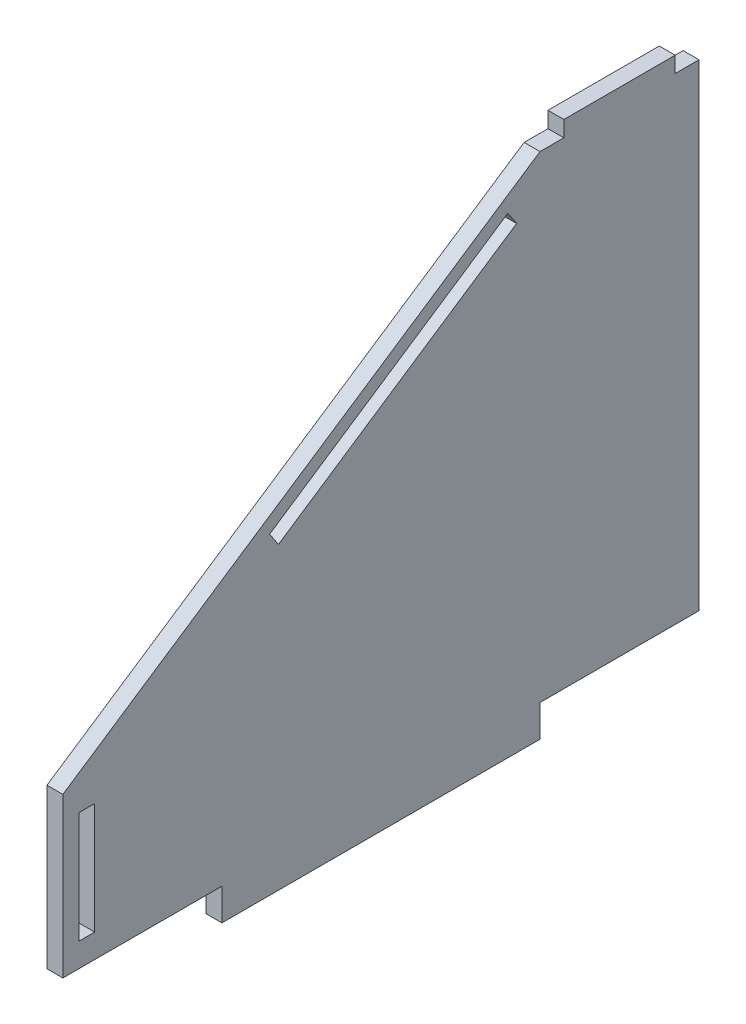
ISO-10303-21;
HEADER;
FILE_DESCRIPTION(('STEP AP214'),'2;1');
FILE_NAME('part.step','',(''),(''),'','','');
FILE_SCHEMA(('AUTOMOTIVE_DESIGN { 1 0 10303 214 1 1 1 1 }'));
ENDSEC;
DATA;
#1=APPLICATION_CONTEXT('core data for automotive mechanical design processes');
#2=APPLICATION_PROTOCOL_DEFINITION('international standard','automotive_design',2000,#1);
#3=PRODUCT_CONTEXT('',#1,'mechanical');
#4=PRODUCT('Part','Part','',(#3));
#5=PRODUCT_RELATED_PRODUCT_CATEGORY('part','',(#4));
#6=PRODUCT_DEFINITION_FORMATION('','',#4);
#7=PRODUCT_DEFINITION_CONTEXT('part definition',#1,'design');
#8=PRODUCT_DEFINITION('design','',#6,#7);
#9=PRODUCT_DEFINITION_SHAPE('','',#8);
#10=(LENGTH_UNIT() NAMED_UNIT(*) SI_UNIT(.MILLI.,.METRE.));
#11=(NAMED_UNIT(*) PLANE_ANGLE_UNIT() SI_UNIT($,.RADIAN.));
#12=(NAMED_UNIT(*) SI_UNIT($,.STERADIAN.) SOLID_ANGLE_UNIT());
#13=UNCERTAINTY_MEASURE_WITH_UNIT(LENGTH_MEASURE(1.E-05),#10,'distance_accuracy_value','');
#14=(GEOMETRIC_REPRESENTATION_CONTEXT(3) GLOBAL_UNCERTAINTY_ASSIGNED_CONTEXT((#13)) GLOBAL_UNIT_ASSIGNED_CONTEXT((#10,
#11,#12)) REPRESENTATION_CONTEXT('',''));
#15=CARTESIAN_POINT('',(0.,0.,0.));
#16=DIRECTION('',(0.,0.,1.));
#17=DIRECTION('',(1.,0.,0.));
#18=AXIS2_PLACEMENT_3D('',#15,#16,#17);
#19=CARTESIAN_POINT('',(5.,0.,0.));
#20=DIRECTION('',(1.,0.,0.));
#21=DIRECTION('',(0.,0.,-1.));
#22=AXIS2_PLACEMENT_3D('',#19,#20,#21);
#23=PLANE('',#22);
#24=DIRECTION('',(0.,0.,-1.));
#25=VECTOR('',#24,1.);
#26=CARTESIAN_POINT('',(5.,7.5,-5.00000000000001));
#27=LINE('',#26,#25);
#28=CARTESIAN_POINT('',(5.,7.5,-5.00000000000001));
#29=VERTEX_POINT('',#28);
#30=CARTESIAN_POINT('',(5.,7.5,-10.));
#31=VERTEX_POINT('',#30);
#32=EDGE_CURVE('E213',#29,#31,#27,.T.);
#33=ORIENTED_EDGE('',*,*,#32,.F.);
#34=DIRECTION('',(0.,-1.,0.));
#35=VECTOR('',#34,1.);
#36=CARTESIAN_POINT('',(5.,42.5,-5.));
#37=LINE('',#36,#35);
#38=CARTESIAN_POINT('',(5.,42.5,-5.));
#39=VERTEX_POINT('',#38);
#40=EDGE_CURVE('E211',#39,#29,#37,.T.);
#41=ORIENTED_EDGE('',*,*,#40,.F.);
#42=DIRECTION('',(0.,0.,1.));
#43=VECTOR('',#42,1.);
#44=CARTESIAN_POINT('',(5.,42.5,-5.));
#45=LINE('',#44,#43);
#46=CARTESIAN_POINT('',(5.,42.5,-10.));
#47=VERTEX_POINT('',#46);
#48=EDGE_CURVE('E219',#47,#39,#45,.T.);
#49=ORIENTED_EDGE('',*,*,#48,.F.);
#50=DIRECTION('',(0.,1.,0.));
#51=VECTOR('',#50,1.);
#52=CARTESIAN_POINT('',(5.,42.5,-10.));
#53=LINE('',#52,#51);
#54=EDGE_CURVE('E216',#31,#47,#53,.T.);
#55=ORIENTED_EDGE('',*,*,#54,.F.);
#56=EDGE_LOOP('',(#33,#41,#49,#55));
#57=FACE_BOUND('',#56,.T.);
#58=DIRECTION('',(0.,0.,1.));
#59=VECTOR('',#58,1.);
#60=CARTESIAN_POINT('',(5.,150.,-192.5));
#61=LINE('',#60,#59);
#62=CARTESIAN_POINT('',(5.,150.,-200.));
#63=VERTEX_POINT('',#62);
#64=CARTESIAN_POINT('',(5.,150.,-192.5));
#65=VERTEX_POINT('',#64);
#66=EDGE_CURVE('E242',#63,#65,#61,.T.);
#67=ORIENTED_EDGE('',*,*,#66,.T.);
#68=DIRECTION('',(0.,1.,0.));
#69=VECTOR('',#68,1.);
#70=CARTESIAN_POINT('',(5.,150.,-192.5));
#71=LINE('',#70,#69);
#72=CARTESIAN_POINT('',(5.,155.,-192.5));
#73=VERTEX_POINT('',#72);
#74=EDGE_CURVE('E245',#65,#73,#71,.T.);
#75=ORIENTED_EDGE('',*,*,#74,.T.);
#76=DIRECTION('',(0.,0.,1.));
#77=VECTOR('',#76,1.);
#78=CARTESIAN_POINT('',(5.,155.,-157.5));
#79=LINE('',#78,#77);
#80=CARTESIAN_POINT('',(5.,155.,-157.5));
#81=VERTEX_POINT('',#80);
#82=EDGE_CURVE('E248',#73,#81,#79,.T.);
#83=ORIENTED_EDGE('',*,*,#82,.T.);
#84=DIRECTION('',(0.,-1.,0.));
#85=VECTOR('',#84,1.);
#86=CARTESIAN_POINT('',(5.,150.,-157.5));
#87=LINE('',#86,#85);
#88=CARTESIAN_POINT('',(5.,150.,-157.5));
#89=VERTEX_POINT('',#88);
#90=EDGE_CURVE('E250',#81,#89,#87,.T.);
#91=ORIENTED_EDGE('',*,*,#90,.T.);
#92=DIRECTION('',(0.,0.,1.));
#93=VECTOR('',#92,1.);
#94=CARTESIAN_POINT('',(5.,150.,-150.));
#95=LINE('',#94,#93);
#96=CARTESIAN_POINT('',(5.,150.,-150.));
#97=VERTEX_POINT('',#96);
#98=EDGE_CURVE('E252',#89,#97,#95,.T.);
#99=ORIENTED_EDGE('',*,*,#98,.T.);
#100=DIRECTION('',(0.,-0.554700196225229,0.832050294337844));
#101=VECTOR('',#100,1.);
#102=CARTESIAN_POINT('',(5.,150.,-150.));
#103=LINE('',#102,#101);
#104=CARTESIAN_POINT('',(5.,50.,0.));
#105=VERTEX_POINT('',#104);
#106=EDGE_CURVE('E254',#97,#105,#103,.T.);
#107=ORIENTED_EDGE('',*,*,#106,.T.);
#108=DIRECTION('',(0.,-1.,0.));
#109=VECTOR('',#108,1.);
#110=CARTESIAN_POINT('',(5.,0.,0.));
#111=LINE('',#110,#109);
#112=CARTESIAN_POINT('',(5.,0.,0.));
#113=VERTEX_POINT('',#112);
#114=EDGE_CURVE('E256',#105,#113,#111,.T.);
#115=ORIENTED_EDGE('',*,*,#114,.T.);
#116=DIRECTION('',(0.,0.,-1.));
#117=VECTOR('',#116,1.);
#118=CARTESIAN_POINT('',(5.,0.,0.));
#119=LINE('',#118,#117);
#120=CARTESIAN_POINT('',(5.,0.,-50.));
#121=VERTEX_POINT('',#120);
#122=EDGE_CURVE('E258',#113,#121,#119,.T.);
#123=ORIENTED_EDGE('',*,*,#122,.T.);
#124=DIRECTION('',(0.,-1.,0.));
#125=VECTOR('',#124,1.);
#126=CARTESIAN_POINT('',(5.,0.,-50.));
#127=LINE('',#126,#125);
#128=CARTESIAN_POINT('',(5.,-10.,-50.));
#129=VERTEX_POINT('',#128);
#130=EDGE_CURVE('E260',#121,#129,#127,.T.);
#131=ORIENTED_EDGE('',*,*,#130,.T.);
#132=DIRECTION('',(0.,0.,-1.));
#133=VECTOR('',#132,1.);
#134=CARTESIAN_POINT('',(5.,-10.,-50.));
#135=LINE('',#134,#133);
#136=CARTESIAN_POINT('',(5.,-10.,-150.));
#137=VERTEX_POINT('',#136);
#138=EDGE_CURVE('E262',#129,#137,#135,.T.);
#139=ORIENTED_EDGE('',*,*,#138,.T.);
#140=DIRECTION('',(0.,1.,0.));
#141=VECTOR('',#140,1.);
#142=CARTESIAN_POINT('',(5.,0.,-150.));
#143=LINE('',#142,#141);
#144=CARTESIAN_POINT('',(5.,0.,-150.));
#145=VERTEX_POINT('',#144);
#146=EDGE_CURVE('E264',#137,#145,#143,.T.);
#147=ORIENTED_EDGE('',*,*,#146,.T.);
#148=DIRECTION('',(0.,0.,-1.));
#149=VECTOR('',#148,1.);
#150=CARTESIAN_POINT('',(5.,0.,-150.));
#151=LINE('',#150,#149);
#152=CARTESIAN_POINT('',(5.,0.,-200.));
#153=VERTEX_POINT('',#152);
#154=EDGE_CURVE('E266',#145,#153,#151,.T.);
#155=ORIENTED_EDGE('',*,*,#154,.T.);
#156=DIRECTION('',(0.,1.,0.));
#157=VECTOR('',#156,1.);
#158=CARTESIAN_POINT('',(5.,0.,-200.));
#159=LINE('',#158,#157);
#160=EDGE_CURVE('E268',#153,#63,#159,.T.);
#161=ORIENTED_EDGE('',*,*,#160,.T.);
#162=EDGE_LOOP('',(#67,#75,#83,#91,#99,#107,#115,#123,#131,#139,#147,#155,#161));
#163=FACE_BOUND('',#162,.T.);
#164=DIRECTION('',(0.,0.554700196225229,-0.832050294337843));
#165=VECTOR('',#164,1.);
#166=CARTESIAN_POINT('',(5.,134.096099521915,-142.658027471532));
#167=LINE('',#166,#165);
#168=CARTESIAN_POINT('',(5.,84.1730818616441,-67.7735009811262));
#169=VERTEX_POINT('',#168);
#170=CARTESIAN_POINT('',(5.,134.096099521915,-142.658027471532));
#171=VERTEX_POINT('',#170);
#172=EDGE_CURVE('E183',#169,#171,#167,.T.);
#173=ORIENTED_EDGE('',*,*,#172,.F.);
#174=DIRECTION('',(0.,-0.832050294337844,-0.554700196225229));
#175=VECTOR('',#174,1.);
#176=CARTESIAN_POINT('',(5.,84.1730818616441,-67.7735009811262));
#177=LINE('',#176,#175);
#178=CARTESIAN_POINT('',(5.,88.3333333333334,-65.));
#179=VERTEX_POINT('',#178);
#180=EDGE_CURVE('E175',#179,#169,#177,.T.);
#181=ORIENTED_EDGE('',*,*,#180,.F.);
#182=DIRECTION('',(0.,-0.554700196225229,0.832050294337844));
#183=VECTOR('',#182,1.);
#184=CARTESIAN_POINT('',(5.,88.3333333333334,-65.));
#185=LINE('',#184,#183);
#186=CARTESIAN_POINT('',(5.,138.256350993604,-139.884526490406));
#187=VERTEX_POINT('',#186);
#188=EDGE_CURVE('E197',#187,#179,#185,.T.);
#189=ORIENTED_EDGE('',*,*,#188,.F.);
#190=DIRECTION('',(0.,0.832050294337843,0.55470019622523));
#191=VECTOR('',#190,1.);
#192=CARTESIAN_POINT('',(5.,138.256350993604,-139.884526490406));
#193=LINE('',#192,#191);
#194=EDGE_CURVE('E195',#171,#187,#193,.T.);
#195=ORIENTED_EDGE('',*,*,#194,.F.);
#196=EDGE_LOOP('',(#173,#181,#189,#195));
#197=FACE_BOUND('',#196,.T.);
#198=ADVANCED_FACE('F32',(#57,#163,#197),#23,.T.);
#199=CARTESIAN_POINT('',(0.,0.,0.));
#200=DIRECTION('',(1.,0.,0.));
#201=DIRECTION('',(0.,0.,-1.));
#202=AXIS2_PLACEMENT_3D('',#199,#200,#201);
#203=PLANE('',#202);
#204=DIRECTION('',(0.,-1.,0.));
#205=VECTOR('',#204,1.);
#206=CARTESIAN_POINT('',(0.,42.5,-5.));
#207=LINE('',#206,#205);
#208=CARTESIAN_POINT('',(0.,42.5,-5.));
#209=VERTEX_POINT('',#208);
#210=CARTESIAN_POINT('',(0.,7.5,-5.00000000000001));
#211=VERTEX_POINT('',#210);
#212=EDGE_CURVE('E191',#209,#211,#207,.T.);
#213=ORIENTED_EDGE('',*,*,#212,.T.);
#214=DIRECTION('',(0.,0.,-1.));
#215=VECTOR('',#214,1.);
#216=CARTESIAN_POINT('',(0.,7.5,-5.00000000000001));
#217=LINE('',#216,#215);
#218=CARTESIAN_POINT('',(0.,7.5,-10.));
#219=VERTEX_POINT('',#218);
#220=EDGE_CURVE('E224',#211,#219,#217,.T.);
#221=ORIENTED_EDGE('',*,*,#220,.T.);
#222=DIRECTION('',(0.,1.,0.));
#223=VECTOR('',#222,1.);
#224=CARTESIAN_POINT('',(0.,42.5,-10.));
#225=LINE('',#224,#223);
#226=CARTESIAN_POINT('',(0.,42.5,-10.));
#227=VERTEX_POINT('',#226);
#228=EDGE_CURVE('E227',#219,#227,#225,.T.);
#229=ORIENTED_EDGE('',*,*,#228,.T.);
#230=DIRECTION('',(0.,0.,1.));
#231=VECTOR('',#230,1.);
#232=CARTESIAN_POINT('',(0.,42.5,-5.));
#233=LINE('',#232,#231);
#234=EDGE_CURVE('E214',#227,#209,#233,.T.);
#235=ORIENTED_EDGE('',*,*,#234,.T.);
#236=EDGE_LOOP('',(#213,#221,#229,#235));
#237=FACE_BOUND('',#236,.T.);
#238=DIRECTION('',(0.,0.,1.));
#239=VECTOR('',#238,1.);
#240=CARTESIAN_POINT('',(0.,150.,-192.5));
#241=LINE('',#240,#239);
#242=CARTESIAN_POINT('',(0.,150.,-200.));
#243=VERTEX_POINT('',#242);
#244=CARTESIAN_POINT('',(0.,150.,-192.5));
#245=VERTEX_POINT('',#244);
#246=EDGE_CURVE('E241',#243,#245,#241,.T.);
#247=ORIENTED_EDGE('',*,*,#246,.F.);
#248=DIRECTION('',(0.,1.,0.));
#249=VECTOR('',#248,1.);
#250=CARTESIAN_POINT('',(0.,0.,-200.));
#251=LINE('',#250,#249);
#252=CARTESIAN_POINT('',(0.,0.,-200.));
#253=VERTEX_POINT('',#252);
#254=EDGE_CURVE('E246',#253,#243,#251,.T.);
#255=ORIENTED_EDGE('',*,*,#254,.F.);
#256=DIRECTION('',(0.,0.,-1.));
#257=VECTOR('',#256,1.);
#258=CARTESIAN_POINT('',(0.,0.,-150.));
#259=LINE('',#258,#257);
#260=CARTESIAN_POINT('',(0.,0.,-150.));
#261=VERTEX_POINT('',#260);
#262=EDGE_CURVE('E293',#261,#253,#259,.T.);
#263=ORIENTED_EDGE('',*,*,#262,.F.);
#264=DIRECTION('',(0.,1.,0.));
#265=VECTOR('',#264,1.);
#266=CARTESIAN_POINT('',(0.,0.,-150.));
#267=LINE('',#266,#265);
#268=CARTESIAN_POINT('',(0.,-10.,-150.));
#269=VERTEX_POINT('',#268);
#270=EDGE_CURVE('E291',#269,#261,#267,.T.);
#271=ORIENTED_EDGE('',*,*,#270,.F.);
#272=DIRECTION('',(0.,0.,-1.));
#273=VECTOR('',#272,1.);
#274=CARTESIAN_POINT('',(0.,-10.,-50.));
#275=LINE('',#274,#273);
#276=CARTESIAN_POINT('',(0.,-10.,-50.));
#277=VERTEX_POINT('',#276);
#278=EDGE_CURVE('E289',#277,#269,#275,.T.);
#279=ORIENTED_EDGE('',*,*,#278,.F.);
#280=DIRECTION('',(0.,-1.,0.));
#281=VECTOR('',#280,1.);
#282=CARTESIAN_POINT('',(0.,0.,-50.));
#283=LINE('',#282,#281);
#284=CARTESIAN_POINT('',(0.,0.,-50.));
#285=VERTEX_POINT('',#284);
#286=EDGE_CURVE('E287',#285,#277,#283,.T.);
#287=ORIENTED_EDGE('',*,*,#286,.F.);
#288=DIRECTION('',(0.,0.,-1.));
#289=VECTOR('',#288,1.);
#290=CARTESIAN_POINT('',(0.,0.,0.));
#291=LINE('',#290,#289);
#292=CARTESIAN_POINT('',(0.,0.,0.));
#293=VERTEX_POINT('',#292);
#294=EDGE_CURVE('E285',#293,#285,#291,.T.);
#295=ORIENTED_EDGE('',*,*,#294,.F.);
#296=DIRECTION('',(0.,-1.,0.));
#297=VECTOR('',#296,1.);
#298=CARTESIAN_POINT('',(0.,0.,0.));
#299=LINE('',#298,#297);
#300=CARTESIAN_POINT('',(0.,50.,0.));
#301=VERTEX_POINT('',#300);
#302=EDGE_CURVE('E283',#301,#293,#299,.T.);
#303=ORIENTED_EDGE('',*,*,#302,.F.);
#304=DIRECTION('',(0.,-0.554700196225229,0.832050294337844));
#305=VECTOR('',#304,1.);
#306=CARTESIAN_POINT('',(0.,150.,-150.));
#307=LINE('',#306,#305);
#308=CARTESIAN_POINT('',(0.,150.,-150.));
#309=VERTEX_POINT('',#308);
#310=EDGE_CURVE('E281',#309,#301,#307,.T.);
#311=ORIENTED_EDGE('',*,*,#310,.F.);
#312=DIRECTION('',(0.,0.,1.));
#313=VECTOR('',#312,1.);
#314=CARTESIAN_POINT('',(0.,150.,-150.));
#315=LINE('',#314,#313);
#316=CARTESIAN_POINT('',(0.,150.,-157.5));
#317=VERTEX_POINT('',#316);
#318=EDGE_CURVE('E279',#317,#309,#315,.T.);
#319=ORIENTED_EDGE('',*,*,#318,.F.);
#320=DIRECTION('',(0.,-1.,0.));
#321=VECTOR('',#320,1.);
#322=CARTESIAN_POINT('',(0.,150.,-157.5));
#323=LINE('',#322,#321);
#324=CARTESIAN_POINT('',(0.,155.,-157.5));
#325=VERTEX_POINT('',#324);
#326=EDGE_CURVE('E277',#325,#317,#323,.T.);
#327=ORIENTED_EDGE('',*,*,#326,.F.);
#328=DIRECTION('',(0.,0.,1.));
#329=VECTOR('',#328,1.);
#330=CARTESIAN_POINT('',(0.,155.,-157.5));
#331=LINE('',#330,#329);
#332=CARTESIAN_POINT('',(0.,155.,-192.5));
#333=VERTEX_POINT('',#332);
#334=EDGE_CURVE('E275',#333,#325,#331,.T.);
#335=ORIENTED_EDGE('',*,*,#334,.F.);
#336=DIRECTION('',(0.,1.,0.));
#337=VECTOR('',#336,1.);
#338=CARTESIAN_POINT('',(0.,150.,-192.5));
#339=LINE('',#338,#337);
#340=EDGE_CURVE('E273',#245,#333,#339,.T.);
#341=ORIENTED_EDGE('',*,*,#340,.F.);
#342=EDGE_LOOP('',(#247,#255,#263,#271,#279,#287,#295,#303,#311,#319,#327,#335,#341));
#343=FACE_BOUND('',#342,.T.);
#344=DIRECTION('',(0.,-0.832050294337844,-0.554700196225229));
#345=VECTOR('',#344,1.);
#346=CARTESIAN_POINT('',(0.,84.1730818616441,-67.7735009811262));
#347=LINE('',#346,#345);
#348=CARTESIAN_POINT('',(0.,88.3333333333334,-65.));
#349=VERTEX_POINT('',#348);
#350=CARTESIAN_POINT('',(0.,84.1730818616441,-67.7735009811262));
#351=VERTEX_POINT('',#350);
#352=EDGE_CURVE('E55',#349,#351,#347,.T.);
#353=ORIENTED_EDGE('',*,*,#352,.T.);
#354=DIRECTION('',(0.,0.554700196225229,-0.832050294337843));
#355=VECTOR('',#354,1.);
#356=CARTESIAN_POINT('',(0.,134.096099521915,-142.658027471532));
#357=LINE('',#356,#355);
#358=CARTESIAN_POINT('',(0.,134.096099521915,-142.658027471532));
#359=VERTEX_POINT('',#358);
#360=EDGE_CURVE('E190',#351,#359,#357,.T.);
#361=ORIENTED_EDGE('',*,*,#360,.T.);
#362=DIRECTION('',(0.,0.832050294337843,0.55470019622523));
#363=VECTOR('',#362,1.);
#364=CARTESIAN_POINT('',(0.,138.256350993604,-139.884526490406));
#365=LINE('',#364,#363);
#366=CARTESIAN_POINT('',(0.,138.256350993604,-139.884526490406));
#367=VERTEX_POINT('',#366);
#368=EDGE_CURVE('E203',#359,#367,#365,.T.);
#369=ORIENTED_EDGE('',*,*,#368,.T.);
#370=DIRECTION('',(0.,-0.554700196225229,0.832050294337844));
#371=VECTOR('',#370,1.);
#372=CARTESIAN_POINT('',(0.,88.3333333333334,-65.));
#373=LINE('',#372,#371);
#374=EDGE_CURVE('E184',#367,#349,#373,.T.);
#375=ORIENTED_EDGE('',*,*,#374,.T.);
#376=EDGE_LOOP('',(#353,#361,#369,#375));
#377=FACE_BOUND('',#376,.T.);
#378=ADVANCED_FACE('F338',(#237,#343,#377),#203,.F.);
#379=CARTESIAN_POINT('',(5.,150.,-192.5));
#380=DIRECTION('',(0.,-1.,0.));
#381=DIRECTION('',(0.,0.,-1.));
#382=AXIS2_PLACEMENT_3D('',#379,#380,#381);
#383=PLANE('',#382);
#384=ORIENTED_EDGE('',*,*,#246,.T.);
#385=DIRECTION('',(-1.,0.,0.));
#386=VECTOR('',#385,1.);
#387=CARTESIAN_POINT('',(5.,150.,-192.5));
#388=LINE('',#387,#386);
#389=EDGE_CURVE('E11',#65,#245,#388,.T.);
#390=ORIENTED_EDGE('',*,*,#389,.F.);
#391=ORIENTED_EDGE('',*,*,#66,.F.);
#392=DIRECTION('',(-1.,0.,0.));
#393=VECTOR('',#392,1.);
#394=CARTESIAN_POINT('',(5.,150.,-200.));
#395=LINE('',#394,#393);
#396=EDGE_CURVE('E270',#63,#243,#395,.T.);
#397=ORIENTED_EDGE('',*,*,#396,.T.);
#398=EDGE_LOOP('',(#384,#390,#391,#397));
#399=FACE_BOUND('',#398,.T.);
#400=ADVANCED_FACE('F34',(#399),#383,.F.);
#401=CARTESIAN_POINT('',(5.,150.,-192.5));
#402=DIRECTION('',(0.,0.,1.));
#403=DIRECTION('',(1.,0.,0.));
#404=AXIS2_PLACEMENT_3D('',#401,#402,#403);
#405=PLANE('',#404);
#406=ORIENTED_EDGE('',*,*,#340,.T.);
#407=DIRECTION('',(-1.,0.,0.));
#408=VECTOR('',#407,1.);
#409=CARTESIAN_POINT('',(5.,155.,-192.5));
#410=LINE('',#409,#408);
#411=EDGE_CURVE('E40',#73,#333,#410,.T.);
#412=ORIENTED_EDGE('',*,*,#411,.F.);
#413=ORIENTED_EDGE('',*,*,#74,.F.);
#414=ORIENTED_EDGE('',*,*,#389,.T.);
#415=EDGE_LOOP('',(#406,#412,#413,#414));
#416=FACE_BOUND('',#415,.T.);
#417=ADVANCED_FACE('F355',(#416),#405,.F.);
#418=CARTESIAN_POINT('',(5.,155.,-157.5));
#419=DIRECTION('',(0.,-1.,0.));
#420=DIRECTION('',(0.,0.,-1.));
#421=AXIS2_PLACEMENT_3D('',#418,#419,#420);
#422=PLANE('',#421);
#423=ORIENTED_EDGE('',*,*,#334,.T.);
#424=DIRECTION('',(-1.,0.,0.));
#425=VECTOR('',#424,1.);
#426=CARTESIAN_POINT('',(5.,155.,-157.5));
#427=LINE('',#426,#425);
#428=EDGE_CURVE('E325',#81,#325,#427,.T.);
#429=ORIENTED_EDGE('',*,*,#428,.F.);
#430=ORIENTED_EDGE('',*,*,#82,.F.);
#431=ORIENTED_EDGE('',*,*,#411,.T.);
#432=EDGE_LOOP('',(#423,#429,#430,#431));
#433=FACE_BOUND('',#432,.T.);
#434=ADVANCED_FACE('F332',(#433),#422,.F.);
#435=CARTESIAN_POINT('',(5.,150.,-157.5));
#436=DIRECTION('',(0.,0.,-1.));
#437=DIRECTION('',(-1.,0.,0.));
#438=AXIS2_PLACEMENT_3D('',#435,#436,#437);
#439=PLANE('',#438);
#440=ORIENTED_EDGE('',*,*,#326,.T.);
#441=DIRECTION('',(-1.,0.,0.));
#442=VECTOR('',#441,1.);
#443=CARTESIAN_POINT('',(5.,150.,-157.5));
#444=LINE('',#443,#442);
#445=EDGE_CURVE('E322',#89,#317,#444,.T.);
#446=ORIENTED_EDGE('',*,*,#445,.F.);
#447=ORIENTED_EDGE('',*,*,#90,.F.);
#448=ORIENTED_EDGE('',*,*,#428,.T.);
#449=EDGE_LOOP('',(#440,#446,#447,#448));
#450=FACE_BOUND('',#449,.T.);
#451=ADVANCED_FACE('F344',(#450),#439,.F.);
#452=CARTESIAN_POINT('',(5.,150.,-150.));
#453=DIRECTION('',(0.,-1.,0.));
#454=DIRECTION('',(0.,0.,-1.));
#455=AXIS2_PLACEMENT_3D('',#452,#453,#454);
#456=PLANE('',#455);
#457=ORIENTED_EDGE('',*,*,#318,.T.);
#458=DIRECTION('',(-1.,0.,0.));
#459=VECTOR('',#458,1.);
#460=CARTESIAN_POINT('',(5.,150.,-150.));
#461=LINE('',#460,#459);
#462=EDGE_CURVE('E319',#97,#309,#461,.T.);
#463=ORIENTED_EDGE('',*,*,#462,.F.);
#464=ORIENTED_EDGE('',*,*,#98,.F.);
#465=ORIENTED_EDGE('',*,*,#445,.T.);
#466=EDGE_LOOP('',(#457,#463,#464,#465));
#467=FACE_BOUND('',#466,.T.);
#468=ADVANCED_FACE('F348',(#467),#456,.F.);
#469=CARTESIAN_POINT('',(5.,150.,-150.));
#470=DIRECTION('',(0.,-0.832050294337844,-0.554700196225229));
#471=DIRECTION('',(0.,0.554700196225229,-0.832050294337844));
#472=AXIS2_PLACEMENT_3D('',#469,#470,#471);
#473=PLANE('',#472);
#474=ORIENTED_EDGE('',*,*,#310,.T.);
#475=DIRECTION('',(-1.,0.,0.));
#476=VECTOR('',#475,1.);
#477=CARTESIAN_POINT('',(5.,50.,0.));
#478=LINE('',#477,#476);
#479=EDGE_CURVE('E316',#105,#301,#478,.T.);
#480=ORIENTED_EDGE('',*,*,#479,.F.);
#481=ORIENTED_EDGE('',*,*,#106,.F.);
#482=ORIENTED_EDGE('',*,*,#462,.T.);
#483=EDGE_LOOP('',(#474,#480,#481,#482));
#484=FACE_BOUND('',#483,.T.);
#485=ADVANCED_FACE('F393',(#484),#473,.F.);
#486=CARTESIAN_POINT('',(5.,0.,0.));
#487=DIRECTION('',(0.,0.,-1.));
#488=DIRECTION('',(-1.,0.,0.));
#489=AXIS2_PLACEMENT_3D('',#486,#487,#488);
#490=PLANE('',#489);
#491=ORIENTED_EDGE('',*,*,#302,.T.);
#492=DIRECTION('',(-1.,0.,0.));
#493=VECTOR('',#492,1.);
#494=CARTESIAN_POINT('',(5.,0.,0.));
#495=LINE('',#494,#493);
#496=EDGE_CURVE('E313',#113,#293,#495,.T.);
#497=ORIENTED_EDGE('',*,*,#496,.F.);
#498=ORIENTED_EDGE('',*,*,#114,.F.);
#499=ORIENTED_EDGE('',*,*,#479,.T.);
#500=EDGE_LOOP('',(#491,#497,#498,#499));
#501=FACE_BOUND('',#500,.T.);
#502=ADVANCED_FACE('F390',(#501),#490,.F.);
#503=CARTESIAN_POINT('',(5.,0.,0.));
#504=DIRECTION('',(0.,1.,0.));
#505=DIRECTION('',(0.,0.,1.));
#506=AXIS2_PLACEMENT_3D('',#503,#504,#505);
#507=PLANE('',#506);
#508=ORIENTED_EDGE('',*,*,#294,.T.);
#509=DIRECTION('',(-1.,0.,0.));
#510=VECTOR('',#509,1.);
#511=CARTESIAN_POINT('',(5.,0.,-50.));
#512=LINE('',#511,#510);
#513=EDGE_CURVE('E310',#121,#285,#512,.T.);
#514=ORIENTED_EDGE('',*,*,#513,.F.);
#515=ORIENTED_EDGE('',*,*,#122,.F.);
#516=ORIENTED_EDGE('',*,*,#496,.T.);
#517=EDGE_LOOP('',(#508,#514,#515,#516));
#518=FACE_BOUND('',#517,.T.);
#519=ADVANCED_FACE('F386',(#518),#507,.F.);
#520=CARTESIAN_POINT('',(5.,0.,-50.));
#521=DIRECTION('',(0.,0.,-1.));
#522=DIRECTION('',(-1.,0.,0.));
#523=AXIS2_PLACEMENT_3D('',#520,#521,#522);
#524=PLANE('',#523);
#525=ORIENTED_EDGE('',*,*,#286,.T.);
#526=DIRECTION('',(-1.,0.,0.));
#527=VECTOR('',#526,1.);
#528=CARTESIAN_POINT('',(5.,-10.,-50.));
#529=LINE('',#528,#527);
#530=EDGE_CURVE('E307',#129,#277,#529,.T.);
#531=ORIENTED_EDGE('',*,*,#530,.F.);
#532=ORIENTED_EDGE('',*,*,#130,.F.);
#533=ORIENTED_EDGE('',*,*,#513,.T.);
#534=EDGE_LOOP('',(#525,#531,#532,#533));
#535=FACE_BOUND('',#534,.T.);
#536=ADVANCED_FACE('F382',(#535),#524,.F.);
#537=CARTESIAN_POINT('',(5.,-10.,-50.));
#538=DIRECTION('',(0.,1.,0.));
#539=DIRECTION('',(0.,0.,1.));
#540=AXIS2_PLACEMENT_3D('',#537,#538,#539);
#541=PLANE('',#540);
#542=ORIENTED_EDGE('',*,*,#278,.T.);
#543=DIRECTION('',(-1.,0.,0.));
#544=VECTOR('',#543,1.);
#545=CARTESIAN_POINT('',(5.,-10.,-150.));
#546=LINE('',#545,#544);
#547=EDGE_CURVE('E304',#137,#269,#546,.T.);
#548=ORIENTED_EDGE('',*,*,#547,.F.);
#549=ORIENTED_EDGE('',*,*,#138,.F.);
#550=ORIENTED_EDGE('',*,*,#530,.T.);
#551=EDGE_LOOP('',(#542,#548,#549,#550));
#552=FACE_BOUND('',#551,.T.);
#553=ADVANCED_FACE('F377',(#552),#541,.F.);
#554=CARTESIAN_POINT('',(5.,0.,-150.));
#555=DIRECTION('',(0.,0.,1.));
#556=DIRECTION('',(1.,0.,0.));
#557=AXIS2_PLACEMENT_3D('',#554,#555,#556);
#558=PLANE('',#557);
#559=ORIENTED_EDGE('',*,*,#270,.T.);
#560=DIRECTION('',(-1.,0.,0.));
#561=VECTOR('',#560,1.);
#562=CARTESIAN_POINT('',(5.,0.,-150.));
#563=LINE('',#562,#561);
#564=EDGE_CURVE('E301',#145,#261,#563,.T.);
#565=ORIENTED_EDGE('',*,*,#564,.F.);
#566=ORIENTED_EDGE('',*,*,#146,.F.);
#567=ORIENTED_EDGE('',*,*,#547,.T.);
#568=EDGE_LOOP('',(#559,#565,#566,#567));
#569=FACE_BOUND('',#568,.T.);
#570=ADVANCED_FACE('F371',(#569),#558,.F.);
#571=CARTESIAN_POINT('',(5.,0.,-150.));
#572=DIRECTION('',(0.,1.,0.));
#573=DIRECTION('',(0.,0.,1.));
#574=AXIS2_PLACEMENT_3D('',#571,#572,#573);
#575=PLANE('',#574);
#576=ORIENTED_EDGE('',*,*,#262,.T.);
#577=DIRECTION('',(-1.,0.,0.));
#578=VECTOR('',#577,1.);
#579=CARTESIAN_POINT('',(5.,0.,-200.));
#580=LINE('',#579,#578);
#581=EDGE_CURVE('E298',#153,#253,#580,.T.);
#582=ORIENTED_EDGE('',*,*,#581,.F.);
#583=ORIENTED_EDGE('',*,*,#154,.F.);
#584=ORIENTED_EDGE('',*,*,#564,.T.);
#585=EDGE_LOOP('',(#576,#582,#583,#584));
#586=FACE_BOUND('',#585,.T.);
#587=ADVANCED_FACE('F367',(#586),#575,.F.);
#588=CARTESIAN_POINT('',(5.,0.,-200.));
#589=DIRECTION('',(0.,0.,1.));
#590=DIRECTION('',(1.,0.,0.));
#591=AXIS2_PLACEMENT_3D('',#588,#589,#590);
#592=PLANE('',#591);
#593=ORIENTED_EDGE('',*,*,#254,.T.);
#594=ORIENTED_EDGE('',*,*,#396,.F.);
#595=ORIENTED_EDGE('',*,*,#160,.F.);
#596=ORIENTED_EDGE('',*,*,#581,.T.);
#597=EDGE_LOOP('',(#593,#594,#595,#596));
#598=FACE_BOUND('',#597,.T.);
#599=ADVANCED_FACE('F362',(#598),#592,.F.);
#600=CARTESIAN_POINT('',(5.,42.5,-5.));
#601=DIRECTION('',(0.,0.,-1.));
#602=DIRECTION('',(0.,1.,0.));
#603=AXIS2_PLACEMENT_3D('',#600,#601,#602);
#604=PLANE('',#603);
#605=ORIENTED_EDGE('',*,*,#212,.F.);
#606=DIRECTION('',(-1.,0.,0.));
#607=VECTOR('',#606,1.);
#608=CARTESIAN_POINT('',(5.,42.5,-5.));
#609=LINE('',#608,#607);
#610=EDGE_CURVE('E221',#39,#209,#609,.T.);
#611=ORIENTED_EDGE('',*,*,#610,.F.);
#612=ORIENTED_EDGE('',*,*,#40,.T.);
#613=DIRECTION('',(-1.,0.,0.));
#614=VECTOR('',#613,1.);
#615=CARTESIAN_POINT('',(5.,7.5,-5.00000000000001));
#616=LINE('',#615,#614);
#617=EDGE_CURVE('E238',#29,#211,#616,.T.);
#618=ORIENTED_EDGE('',*,*,#617,.T.);
#619=EDGE_LOOP('',(#605,#611,#612,#618));
#620=FACE_BOUND('',#619,.T.);
#621=ADVANCED_FACE('F412',(#620),#604,.T.);
#622=CARTESIAN_POINT('',(5.,7.5,-5.00000000000001));
#623=DIRECTION('',(0.,1.,0.));
#624=DIRECTION('',(0.,0.,1.));
#625=AXIS2_PLACEMENT_3D('',#622,#623,#624);
#626=PLANE('',#625);
#627=ORIENTED_EDGE('',*,*,#220,.F.);
#628=ORIENTED_EDGE('',*,*,#617,.F.);
#629=ORIENTED_EDGE('',*,*,#32,.T.);
#630=DIRECTION('',(-1.,0.,0.));
#631=VECTOR('',#630,1.);
#632=CARTESIAN_POINT('',(5.,7.5,-10.));
#633=LINE('',#632,#631);
#634=EDGE_CURVE('E236',#31,#219,#633,.T.);
#635=ORIENTED_EDGE('',*,*,#634,.T.);
#636=EDGE_LOOP('',(#627,#628,#629,#635));
#637=FACE_BOUND('',#636,.T.);
#638=ADVANCED_FACE('F456',(#637),#626,.T.);
#639=CARTESIAN_POINT('',(5.,42.5,-10.));
#640=DIRECTION('',(0.,0.,1.));
#641=DIRECTION('',(0.,-1.,0.));
#642=AXIS2_PLACEMENT_3D('',#639,#640,#641);
#643=PLANE('',#642);
#644=ORIENTED_EDGE('',*,*,#228,.F.);
#645=ORIENTED_EDGE('',*,*,#634,.F.);
#646=ORIENTED_EDGE('',*,*,#54,.T.);
#647=DIRECTION('',(-1.,0.,0.));
#648=VECTOR('',#647,1.);
#649=CARTESIAN_POINT('',(5.,42.5,-10.));
#650=LINE('',#649,#648);
#651=EDGE_CURVE('E234',#47,#227,#650,.T.);
#652=ORIENTED_EDGE('',*,*,#651,.T.);
#653=EDGE_LOOP('',(#644,#645,#646,#652));
#654=FACE_BOUND('',#653,.T.);
#655=ADVANCED_FACE('F463',(#654),#643,.T.);
#656=CARTESIAN_POINT('',(5.,42.5,-5.));
#657=DIRECTION('',(0.,-1.,0.));
#658=DIRECTION('',(0.,0.,-1.));
#659=AXIS2_PLACEMENT_3D('',#656,#657,#658);
#660=PLANE('',#659);
#661=ORIENTED_EDGE('',*,*,#234,.F.);
#662=ORIENTED_EDGE('',*,*,#651,.F.);
#663=ORIENTED_EDGE('',*,*,#48,.T.);
#664=ORIENTED_EDGE('',*,*,#610,.T.);
#665=EDGE_LOOP('',(#661,#662,#663,#664));
#666=FACE_BOUND('',#665,.T.);
#667=ADVANCED_FACE('F470',(#666),#660,.T.);
#668=CARTESIAN_POINT('',(5.,84.1730818616441,-67.7735009811262));
#669=DIRECTION('',(0.,0.554700196225229,-0.832050294337844));
#670=DIRECTION('',(0.,0.832050294337844,0.554700196225229));
#671=AXIS2_PLACEMENT_3D('',#668,#669,#670);
#672=PLANE('',#671);
#673=ORIENTED_EDGE('',*,*,#352,.F.);
#674=DIRECTION('',(-1.,0.,0.));
#675=VECTOR('',#674,1.);
#676=CARTESIAN_POINT('',(5.,88.3333333333334,-65.));
#677=LINE('',#676,#675);
#678=EDGE_CURVE('E179',#179,#349,#677,.T.);
#679=ORIENTED_EDGE('',*,*,#678,.F.);
#680=ORIENTED_EDGE('',*,*,#180,.T.);
#681=DIRECTION('',(-1.,0.,0.));
#682=VECTOR('',#681,1.);
#683=CARTESIAN_POINT('',(5.,84.1730818616441,-67.7735009811262));
#684=LINE('',#683,#682);
#685=EDGE_CURVE('E178',#169,#351,#684,.T.);
#686=ORIENTED_EDGE('',*,*,#685,.T.);
#687=EDGE_LOOP('',(#673,#679,#680,#686));
#688=FACE_BOUND('',#687,.T.);
#689=ADVANCED_FACE('F177',(#688),#672,.T.);
#690=CARTESIAN_POINT('',(5.,134.096099521915,-142.658027471532));
#691=DIRECTION('',(0.,0.832050294337843,0.554700196225229));
#692=DIRECTION('',(0.,-0.554700196225229,0.832050294337843));
#693=AXIS2_PLACEMENT_3D('',#690,#691,#692);
#694=PLANE('',#693);
#695=ORIENTED_EDGE('',*,*,#360,.F.);
#696=ORIENTED_EDGE('',*,*,#685,.F.);
#697=ORIENTED_EDGE('',*,*,#172,.T.);
#698=DIRECTION('',(-1.,0.,0.));
#699=VECTOR('',#698,1.);
#700=CARTESIAN_POINT('',(5.,134.096099521915,-142.658027471532));
#701=LINE('',#700,#699);
#702=EDGE_CURVE('E192',#171,#359,#701,.T.);
#703=ORIENTED_EDGE('',*,*,#702,.T.);
#704=EDGE_LOOP('',(#695,#696,#697,#703));
#705=FACE_BOUND('',#704,.T.);
#706=ADVANCED_FACE('F187',(#705),#694,.T.);
#707=CARTESIAN_POINT('',(5.,138.256350993604,-139.884526490406));
#708=DIRECTION('',(0.,-0.55470019622523,0.832050294337843));
#709=DIRECTION('',(0.,-0.832050294337843,-0.55470019622523));
#710=AXIS2_PLACEMENT_3D('',#707,#708,#709);
#711=PLANE('',#710);
#712=ORIENTED_EDGE('',*,*,#368,.F.);
#713=ORIENTED_EDGE('',*,*,#702,.F.);
#714=ORIENTED_EDGE('',*,*,#194,.T.);
#715=DIRECTION('',(-1.,0.,0.));
#716=VECTOR('',#715,1.);
#717=CARTESIAN_POINT('',(5.,138.256350993604,-139.884526490406));
#718=LINE('',#717,#716);
#719=EDGE_CURVE('E47',#187,#367,#718,.T.);
#720=ORIENTED_EDGE('',*,*,#719,.T.);
#721=EDGE_LOOP('',(#712,#713,#714,#720));
#722=FACE_BOUND('',#721,.T.);
#723=ADVANCED_FACE('F491',(#722),#711,.T.);
#724=CARTESIAN_POINT('',(5.,88.3333333333334,-65.));
#725=DIRECTION('',(0.,-0.832050294337844,-0.554700196225229));
#726=DIRECTION('',(0.,0.554700196225229,-0.832050294337844));
#727=AXIS2_PLACEMENT_3D('',#724,#725,#726);
#728=PLANE('',#727);
#729=ORIENTED_EDGE('',*,*,#374,.F.);
#730=ORIENTED_EDGE('',*,*,#719,.F.);
#731=ORIENTED_EDGE('',*,*,#188,.T.);
#732=ORIENTED_EDGE('',*,*,#678,.T.);
#733=EDGE_LOOP('',(#729,#730,#731,#732));
#734=FACE_BOUND('',#733,.T.);
#735=ADVANCED_FACE('F498',(#734),#728,.T.);
#736=CLOSED_SHELL('',(#198,#378,#400,#417,#434,#451,#468,#485,#502,#519,#536,#553,#570,#587,
#599,#621,#638,#655,#667,#689,#706,#723,#735));
#737=MANIFOLD_SOLID_BREP('B2',#736);
#738=ADVANCED_BREP_SHAPE_REPRESENTATION('',(#18,#737),#14);
#739=SHAPE_DEFINITION_REPRESENTATION(#9,#738);
ENDSEC;
END-ISO-10303-21;
